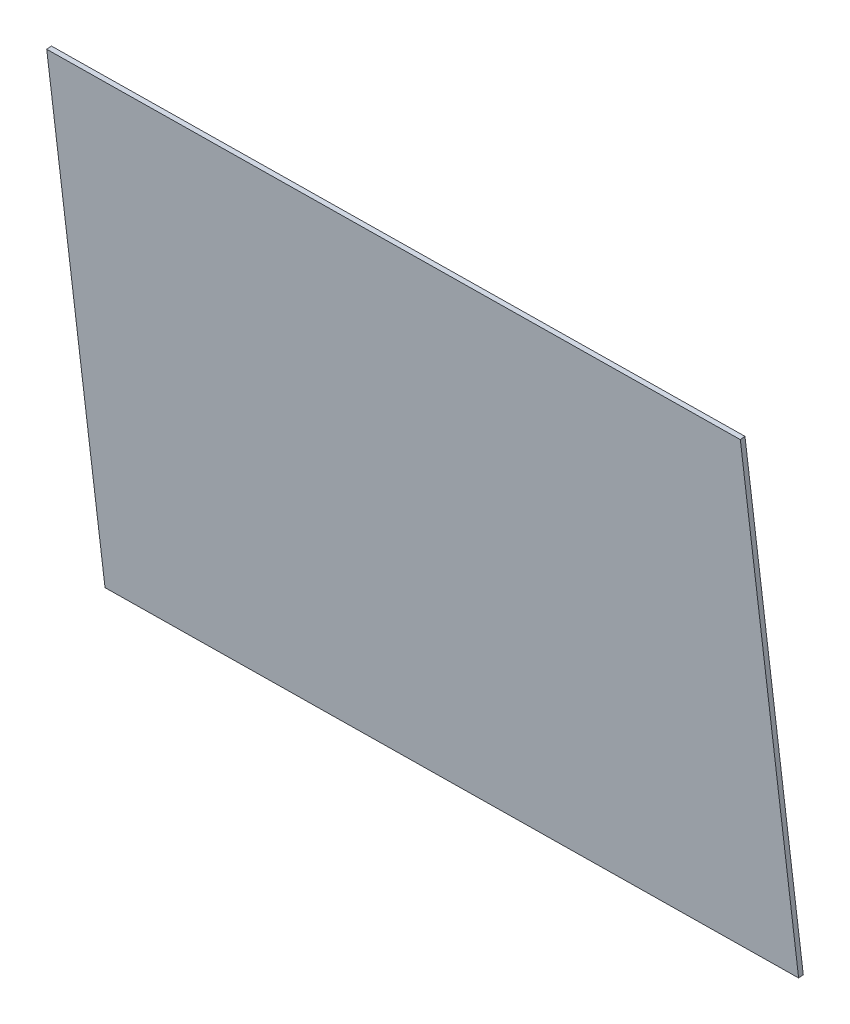
ISO-10303-21;
HEADER;
FILE_DESCRIPTION(('STEP AP214'),'2;1');
FILE_NAME('part.step','',(''),(''),'','','');
FILE_SCHEMA(('AUTOMOTIVE_DESIGN { 1 0 10303 214 1 1 1 1 }'));
ENDSEC;
DATA;
#1=APPLICATION_CONTEXT('core data for automotive mechanical design processes');
#2=APPLICATION_PROTOCOL_DEFINITION('international standard','automotive_design',2000,#1);
#3=PRODUCT_CONTEXT('',#1,'mechanical');
#4=PRODUCT('Part','Part','',(#3));
#5=PRODUCT_RELATED_PRODUCT_CATEGORY('part','',(#4));
#6=PRODUCT_DEFINITION_FORMATION('','',#4);
#7=PRODUCT_DEFINITION_CONTEXT('part definition',#1,'design');
#8=PRODUCT_DEFINITION('design','',#6,#7);
#9=PRODUCT_DEFINITION_SHAPE('','',#8);
#10=(LENGTH_UNIT() NAMED_UNIT(*) SI_UNIT(.MILLI.,.METRE.));
#11=(NAMED_UNIT(*) PLANE_ANGLE_UNIT() SI_UNIT($,.RADIAN.));
#12=(NAMED_UNIT(*) SI_UNIT($,.STERADIAN.) SOLID_ANGLE_UNIT());
#13=UNCERTAINTY_MEASURE_WITH_UNIT(LENGTH_MEASURE(1.E-05),#10,'distance_accuracy_value','');
#14=(GEOMETRIC_REPRESENTATION_CONTEXT(3) GLOBAL_UNCERTAINTY_ASSIGNED_CONTEXT((#13)) GLOBAL_UNIT_ASSIGNED_CONTEXT((#10,
#11,#12)) REPRESENTATION_CONTEXT('',''));
#15=CARTESIAN_POINT('',(0.,0.,0.));
#16=DIRECTION('',(0.,0.,1.));
#17=DIRECTION('',(1.,0.,0.));
#18=AXIS2_PLACEMENT_3D('',#15,#16,#17);
#19=CARTESIAN_POINT('',(129.905594056443,-677.26536333698,-270.175593210275));
#20=DIRECTION('',(0.999899544381668,0.0140963136781484,0.00148158226920706));
#21=DIRECTION('',(-0.0140963291494844,0.999900641816231,0.));
#22=AXIS2_PLACEMENT_3D('',#19,#20,#21);
#23=PLANE('',#22);
#24=DIRECTION('',(0.0141739601147026,-0.994421990056329,-0.104517962796242));
#25=VECTOR('',#24,1.);
#26=CARTESIAN_POINT('',(129.905594056443,-677.056306410445,-272.164637001011));
#27=LINE('',#26,#25);
#28=CARTESIAN_POINT('',(129.905594056443,-677.056306410445,-272.164637001011));
#29=VERTEX_POINT('',#28);
#30=CARTESIAN_POINT('',(132.882125680531,-885.884924322272,-294.113409188222));
#31=VERTEX_POINT('',#30);
#32=EDGE_CURVE('E102',#29,#31,#27,.T.);
#33=ORIENTED_EDGE('',*,*,#32,.T.);
#34=DIRECTION('',(0.,0.104528463267653,-0.994521895368273));
#35=VECTOR('',#34,1.);
#36=CARTESIAN_POINT('',(132.882125680531,-886.093981248808,-292.124365397485));
#37=LINE('',#36,#35);
#38=CARTESIAN_POINT('',(132.882125680531,-886.093981248808,-292.124365397485));
#39=VERTEX_POINT('',#38);
#40=EDGE_CURVE('E11',#39,#31,#37,.T.);
#41=ORIENTED_EDGE('',*,*,#40,.F.);
#42=DIRECTION('',(0.0141739601147026,-0.994421990056329,-0.104517962796242));
#43=VECTOR('',#42,1.);
#44=CARTESIAN_POINT('',(129.905594056443,-677.26536333698,-270.175593210275));
#45=LINE('',#44,#43);
#46=CARTESIAN_POINT('',(129.905594056443,-677.26536333698,-270.175593210275));
#47=VERTEX_POINT('',#46);
#48=EDGE_CURVE('E90',#47,#39,#45,.T.);
#49=ORIENTED_EDGE('',*,*,#48,.F.);
#50=DIRECTION('',(0.,0.104528463267653,-0.994521895368273));
#51=VECTOR('',#50,1.);
#52=CARTESIAN_POINT('',(129.905594056443,-677.26536333698,-270.175593210275));
#53=LINE('',#52,#51);
#54=EDGE_CURVE('E98',#47,#29,#53,.T.);
#55=ORIENTED_EDGE('',*,*,#54,.T.);
#56=EDGE_LOOP('',(#33,#41,#49,#55));
#57=FACE_BOUND('',#56,.T.);
#58=ADVANCED_FACE('F39',(#57),#23,.F.);
#59=CARTESIAN_POINT('',(132.882125680531,-886.093981248808,-292.124365397485));
#60=DIRECTION('',(-0.0141739601147032,0.994421990056329,0.104517962796242));
#61=DIRECTION('',(0.,-0.104528463267653,0.994521895368273));
#62=AXIS2_PLACEMENT_3D('',#59,#60,#61);
#63=PLANE('',#62);
#64=DIRECTION('',(0.999899544381668,0.0140963136781489,0.00148158226920718));
#65=VECTOR('',#64,1.);
#66=CARTESIAN_POINT('',(132.882125680531,-885.884924322272,-294.113409188222));
#67=LINE('',#66,#65);
#68=CARTESIAN_POINT('',(429.852290361886,-881.698319159862,-293.673379254267));
#69=VERTEX_POINT('',#68);
#70=EDGE_CURVE('E94',#31,#69,#67,.T.);
#71=ORIENTED_EDGE('',*,*,#70,.T.);
#72=DIRECTION('',(0.,0.104528463267653,-0.994521895368273));
#73=VECTOR('',#72,1.);
#74=CARTESIAN_POINT('',(429.852290361886,-881.907376086397,-291.684335463531));
#75=LINE('',#74,#73);
#76=CARTESIAN_POINT('',(429.852290361886,-881.907376086397,-291.684335463531));
#77=VERTEX_POINT('',#76);
#78=EDGE_CURVE('E47',#77,#69,#75,.T.);
#79=ORIENTED_EDGE('',*,*,#78,.F.);
#80=DIRECTION('',(0.999899544381668,0.0140963136781489,0.00148158226920718));
#81=VECTOR('',#80,1.);
#82=CARTESIAN_POINT('',(132.882125680531,-886.093981248808,-292.124365397485));
#83=LINE('',#82,#81);
#84=EDGE_CURVE('E85',#39,#77,#83,.T.);
#85=ORIENTED_EDGE('',*,*,#84,.F.);
#86=ORIENTED_EDGE('',*,*,#40,.T.);
#87=EDGE_LOOP('',(#71,#79,#85,#86));
#88=FACE_BOUND('',#87,.T.);
#89=ADVANCED_FACE('F93',(#88),#63,.F.);
#90=CARTESIAN_POINT('',(426.875758737798,-673.07875817457,-269.73556327632));
#91=DIRECTION('',(-0.999899544381668,-0.0140963136781485,-0.00148158226920708));
#92=DIRECTION('',(0.0140963291494845,-0.999900641816231,0.));
#93=AXIS2_PLACEMENT_3D('',#90,#91,#92);
#94=PLANE('',#93);
#95=DIRECTION('',(-0.0141739601147028,0.994421990056329,0.104517962796242));
#96=VECTOR('',#95,1.);
#97=CARTESIAN_POINT('',(426.875758737798,-672.869701248035,-271.724607067057));
#98=LINE('',#97,#96);
#99=CARTESIAN_POINT('',(426.875758737798,-672.869701248035,-271.724607067057));
#100=VERTEX_POINT('',#99);
#101=EDGE_CURVE('E72',#69,#100,#98,.T.);
#102=ORIENTED_EDGE('',*,*,#101,.T.);
#103=DIRECTION('',(0.,0.104528463267653,-0.994521895368273));
#104=VECTOR('',#103,1.);
#105=CARTESIAN_POINT('',(426.875758737798,-673.07875817457,-269.73556327632));
#106=LINE('',#105,#104);
#107=CARTESIAN_POINT('',(426.875758737798,-673.07875817457,-269.73556327632));
#108=VERTEX_POINT('',#107);
#109=EDGE_CURVE('E95',#108,#100,#106,.T.);
#110=ORIENTED_EDGE('',*,*,#109,.F.);
#111=DIRECTION('',(-0.0141739601147028,0.994421990056329,0.104517962796242));
#112=VECTOR('',#111,1.);
#113=CARTESIAN_POINT('',(426.875758737798,-673.07875817457,-269.73556327632));
#114=LINE('',#113,#112);
#115=EDGE_CURVE('E88',#77,#108,#114,.T.);
#116=ORIENTED_EDGE('',*,*,#115,.F.);
#117=ORIENTED_EDGE('',*,*,#78,.T.);
#118=EDGE_LOOP('',(#102,#110,#116,#117));
#119=FACE_BOUND('',#118,.T.);
#120=ADVANCED_FACE('F96',(#119),#94,.F.);
#121=CARTESIAN_POINT('',(129.905594056443,-677.26536333698,-270.175593210275));
#122=DIRECTION('',(0.0141739601147028,-0.994421990056329,-0.104517962796242));
#123=DIRECTION('',(0.,0.104528463267653,-0.994521895368273));
#124=AXIS2_PLACEMENT_3D('',#121,#122,#123);
#125=PLANE('',#124);
#126=DIRECTION('',(-0.999899544381668,-0.0140963136781485,-0.00148158226920718));
#127=VECTOR('',#126,1.);
#128=CARTESIAN_POINT('',(129.905594056443,-677.056306410445,-272.164637001011));
#129=LINE('',#128,#127);
#130=EDGE_CURVE('E78',#100,#29,#129,.T.);
#131=ORIENTED_EDGE('',*,*,#130,.T.);
#132=ORIENTED_EDGE('',*,*,#54,.F.);
#133=DIRECTION('',(-0.999899544381668,-0.0140963136781485,-0.00148158226920718));
#134=VECTOR('',#133,1.);
#135=CARTESIAN_POINT('',(129.905594056443,-677.26536333698,-270.175593210275));
#136=LINE('',#135,#134);
#137=EDGE_CURVE('E55',#108,#47,#136,.T.);
#138=ORIENTED_EDGE('',*,*,#137,.F.);
#139=ORIENTED_EDGE('',*,*,#109,.T.);
#140=EDGE_LOOP('',(#131,#132,#138,#139));
#141=FACE_BOUND('',#140,.T.);
#142=ADVANCED_FACE('F109',(#141),#125,.F.);
#143=CARTESIAN_POINT('',(0.,20.6863956366177,-196.817907331021));
#144=DIRECTION('',(0.,-0.104528463267653,0.994521895368274));
#145=DIRECTION('',(0.,-0.994521895368274,-0.104528463267653));
#146=AXIS2_PLACEMENT_3D('',#143,#144,#145);
#147=PLANE('',#146);
#148=ORIENTED_EDGE('',*,*,#48,.T.);
#149=ORIENTED_EDGE('',*,*,#84,.T.);
#150=ORIENTED_EDGE('',*,*,#115,.T.);
#151=ORIENTED_EDGE('',*,*,#137,.T.);
#152=EDGE_LOOP('',(#148,#149,#150,#151));
#153=FACE_BOUND('',#152,.T.);
#154=ADVANCED_FACE('F86',(#153),#147,.T.);
#155=CARTESIAN_POINT('',(0.,20.895452563153,-198.806951121758));
#156=DIRECTION('',(0.,-0.104528463267653,0.994521895368274));
#157=DIRECTION('',(0.,-0.994521895368274,-0.104528463267653));
#158=AXIS2_PLACEMENT_3D('',#155,#156,#157);
#159=PLANE('',#158);
#160=ORIENTED_EDGE('',*,*,#32,.F.);
#161=ORIENTED_EDGE('',*,*,#130,.F.);
#162=ORIENTED_EDGE('',*,*,#101,.F.);
#163=ORIENTED_EDGE('',*,*,#70,.F.);
#164=EDGE_LOOP('',(#160,#161,#162,#163));
#165=FACE_BOUND('',#164,.T.);
#166=ADVANCED_FACE('F112',(#165),#159,.F.);
#167=CLOSED_SHELL('',(#58,#89,#120,#142,#154,#166));
#168=MANIFOLD_SOLID_BREP('B2',#167);
#169=ADVANCED_BREP_SHAPE_REPRESENTATION('',(#18,#168),#14);
#170=SHAPE_DEFINITION_REPRESENTATION(#9,#169);
ENDSEC;
END-ISO-10303-21;
